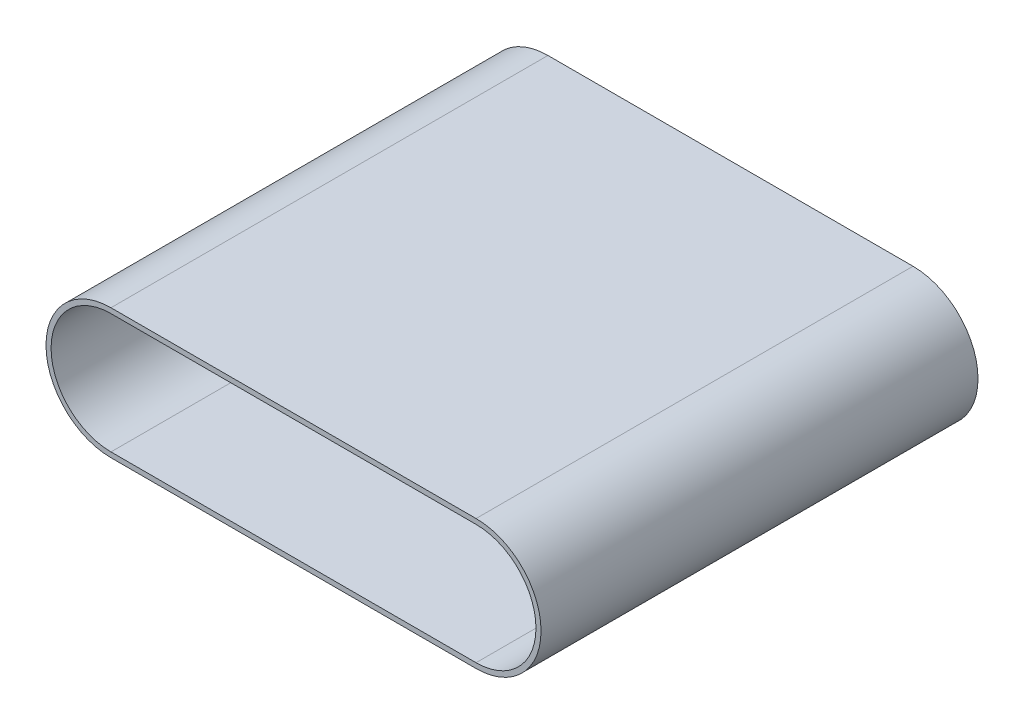
ISO-10303-21;
HEADER;
FILE_DESCRIPTION(('STEP AP214'),'2;1');
FILE_NAME('part.step','',(''),(''),'','','');
FILE_SCHEMA(('AUTOMOTIVE_DESIGN { 1 0 10303 214 1 1 1 1 }'));
ENDSEC;
DATA;
#1=APPLICATION_CONTEXT('core data for automotive mechanical design processes');
#2=APPLICATION_PROTOCOL_DEFINITION('international standard','automotive_design',2000,#1);
#3=PRODUCT_CONTEXT('',#1,'mechanical');
#4=PRODUCT('Part','Part','',(#3));
#5=PRODUCT_RELATED_PRODUCT_CATEGORY('part','',(#4));
#6=PRODUCT_DEFINITION_FORMATION('','',#4);
#7=PRODUCT_DEFINITION_CONTEXT('part definition',#1,'design');
#8=PRODUCT_DEFINITION('design','',#6,#7);
#9=PRODUCT_DEFINITION_SHAPE('','',#8);
#10=(LENGTH_UNIT() NAMED_UNIT(*) SI_UNIT(.MILLI.,.METRE.));
#11=(NAMED_UNIT(*) PLANE_ANGLE_UNIT() SI_UNIT($,.RADIAN.));
#12=(NAMED_UNIT(*) SI_UNIT($,.STERADIAN.) SOLID_ANGLE_UNIT());
#13=UNCERTAINTY_MEASURE_WITH_UNIT(LENGTH_MEASURE(1.E-05),#10,'distance_accuracy_value','');
#14=(GEOMETRIC_REPRESENTATION_CONTEXT(3) GLOBAL_UNCERTAINTY_ASSIGNED_CONTEXT((#13)) GLOBAL_UNIT_ASSIGNED_CONTEXT((#10,
#11,#12)) REPRESENTATION_CONTEXT('',''));
#15=CARTESIAN_POINT('',(0.,0.,0.));
#16=DIRECTION('',(0.,0.,1.));
#17=DIRECTION('',(1.,0.,0.));
#18=AXIS2_PLACEMENT_3D('',#15,#16,#17);
#19=CARTESIAN_POINT('',(0.,0.,65.66));
#20=DIRECTION('',(0.,0.,1.));
#21=DIRECTION('',(1.,0.,0.));
#22=AXIS2_PLACEMENT_3D('',#19,#20,#21);
#23=PLANE('',#22);
#24=CARTESIAN_POINT('',(0.,0.,65.66));
#25=DIRECTION('',(0.,0.,1.));
#26=DIRECTION('',(1.,0.,0.));
#27=AXIS2_PLACEMENT_3D('',#24,#25,#26);
#28=CIRCLE('',#27,9.76200000000001);
#29=CARTESIAN_POINT('',(0.,9.76200000000001,65.66));
#30=VERTEX_POINT('',#29);
#31=CARTESIAN_POINT('',(0.,-9.76200000000001,65.66));
#32=VERTEX_POINT('',#31);
#33=EDGE_CURVE('E183',#30,#32,#28,.T.);
#34=ORIENTED_EDGE('',*,*,#33,.T.);
#35=DIRECTION('',(1.,0.,0.));
#36=VECTOR('',#35,1.);
#37=CARTESIAN_POINT('',(0.,-9.76200000000001,65.66));
#38=LINE('',#37,#36);
#39=CARTESIAN_POINT('',(54.86,-9.762,65.66));
#40=VERTEX_POINT('',#39);
#41=EDGE_CURVE('E187',#32,#40,#38,.T.);
#42=ORIENTED_EDGE('',*,*,#41,.T.);
#43=CARTESIAN_POINT('',(54.86,0.,65.66));
#44=DIRECTION('',(0.,0.,1.));
#45=DIRECTION('',(1.,0.,0.));
#46=AXIS2_PLACEMENT_3D('',#43,#44,#45);
#47=CIRCLE('',#46,9.762);
#48=CARTESIAN_POINT('',(54.86,9.762,65.66));
#49=VERTEX_POINT('',#48);
#50=EDGE_CURVE('E191',#40,#49,#47,.T.);
#51=ORIENTED_EDGE('',*,*,#50,.T.);
#52=DIRECTION('',(-1.,0.,0.));
#53=VECTOR('',#52,1.);
#54=CARTESIAN_POINT('',(0.,9.76200000000001,65.66));
#55=LINE('',#54,#53);
#56=EDGE_CURVE('E194',#49,#30,#55,.T.);
#57=ORIENTED_EDGE('',*,*,#56,.T.);
#58=EDGE_LOOP('',(#34,#42,#51,#57));
#59=FACE_BOUND('',#58,.T.);
#60=DIRECTION('',(1.,0.,0.));
#61=VECTOR('',#60,1.);
#62=CARTESIAN_POINT('',(0.,-9.00000000000001,65.66));
#63=LINE('',#62,#61);
#64=CARTESIAN_POINT('',(0.,-9.00000000000001,65.66));
#65=VERTEX_POINT('',#64);
#66=CARTESIAN_POINT('',(54.86,-9.,65.66));
#67=VERTEX_POINT('',#66);
#68=EDGE_CURVE('E144',#65,#67,#63,.T.);
#69=ORIENTED_EDGE('',*,*,#68,.F.);
#70=CARTESIAN_POINT('',(0.,0.,65.66));
#71=DIRECTION('',(0.,0.,1.));
#72=DIRECTION('',(1.,0.,0.));
#73=AXIS2_PLACEMENT_3D('',#70,#71,#72);
#74=CIRCLE('',#73,9.00000000000001);
#75=CARTESIAN_POINT('',(0.,9.00000000000001,65.66));
#76=VERTEX_POINT('',#75);
#77=EDGE_CURVE('E135',#76,#65,#74,.T.);
#78=ORIENTED_EDGE('',*,*,#77,.F.);
#79=DIRECTION('',(-1.,0.,0.));
#80=VECTOR('',#79,1.);
#81=CARTESIAN_POINT('',(0.,9.00000000000001,65.66));
#82=LINE('',#81,#80);
#83=CARTESIAN_POINT('',(54.86,9.,65.66));
#84=VERTEX_POINT('',#83);
#85=EDGE_CURVE('E161',#84,#76,#82,.T.);
#86=ORIENTED_EDGE('',*,*,#85,.F.);
#87=CARTESIAN_POINT('',(54.86,0.,65.66));
#88=DIRECTION('',(0.,0.,1.));
#89=DIRECTION('',(1.,0.,0.));
#90=AXIS2_PLACEMENT_3D('',#87,#88,#89);
#91=CIRCLE('',#90,9.);
#92=EDGE_CURVE('E157',#67,#84,#91,.T.);
#93=ORIENTED_EDGE('',*,*,#92,.F.);
#94=EDGE_LOOP('',(#69,#78,#86,#93));
#95=FACE_BOUND('',#94,.T.);
#96=ADVANCED_FACE('F69',(#59,#95),#23,.T.);
#97=CARTESIAN_POINT('',(0.,0.,0.));
#98=DIRECTION('',(0.,0.,1.));
#99=DIRECTION('',(1.,0.,0.));
#100=AXIS2_PLACEMENT_3D('',#97,#98,#99);
#101=PLANE('',#100);
#102=CARTESIAN_POINT('',(0.,0.,0.));
#103=DIRECTION('',(0.,0.,1.));
#104=DIRECTION('',(1.,0.,0.));
#105=AXIS2_PLACEMENT_3D('',#102,#103,#104);
#106=CIRCLE('',#105,9.76200000000001);
#107=CARTESIAN_POINT('',(0.,9.76200000000001,0.));
#108=VERTEX_POINT('',#107);
#109=CARTESIAN_POINT('',(0.,-9.76200000000001,0.));
#110=VERTEX_POINT('',#109);
#111=EDGE_CURVE('E153',#108,#110,#106,.T.);
#112=ORIENTED_EDGE('',*,*,#111,.F.);
#113=DIRECTION('',(-1.,0.,0.));
#114=VECTOR('',#113,1.);
#115=CARTESIAN_POINT('',(0.,9.76200000000001,0.));
#116=LINE('',#115,#114);
#117=CARTESIAN_POINT('',(54.86,9.762,0.));
#118=VERTEX_POINT('',#117);
#119=EDGE_CURVE('E188',#118,#108,#116,.T.);
#120=ORIENTED_EDGE('',*,*,#119,.F.);
#121=CARTESIAN_POINT('',(54.86,0.,0.));
#122=DIRECTION('',(0.,0.,1.));
#123=DIRECTION('',(1.,0.,0.));
#124=AXIS2_PLACEMENT_3D('',#121,#122,#123);
#125=CIRCLE('',#124,9.762);
#126=CARTESIAN_POINT('',(54.86,-9.762,0.));
#127=VERTEX_POINT('',#126);
#128=EDGE_CURVE('E204',#127,#118,#125,.T.);
#129=ORIENTED_EDGE('',*,*,#128,.F.);
#130=DIRECTION('',(1.,0.,0.));
#131=VECTOR('',#130,1.);
#132=CARTESIAN_POINT('',(0.,-9.76200000000001,0.));
#133=LINE('',#132,#131);
#134=EDGE_CURVE('E201',#110,#127,#133,.T.);
#135=ORIENTED_EDGE('',*,*,#134,.F.);
#136=EDGE_LOOP('',(#112,#120,#129,#135));
#137=FACE_BOUND('',#136,.T.);
#138=CARTESIAN_POINT('',(0.,0.,0.));
#139=DIRECTION('',(0.,0.,1.));
#140=DIRECTION('',(1.,0.,0.));
#141=AXIS2_PLACEMENT_3D('',#138,#139,#140);
#142=CIRCLE('',#141,9.00000000000001);
#143=CARTESIAN_POINT('',(0.,9.00000000000001,0.));
#144=VERTEX_POINT('',#143);
#145=CARTESIAN_POINT('',(0.,-9.00000000000001,0.));
#146=VERTEX_POINT('',#145);
#147=EDGE_CURVE('E93',#144,#146,#142,.T.);
#148=ORIENTED_EDGE('',*,*,#147,.T.);
#149=DIRECTION('',(1.,0.,0.));
#150=VECTOR('',#149,1.);
#151=CARTESIAN_POINT('',(0.,-9.00000000000001,0.));
#152=LINE('',#151,#150);
#153=CARTESIAN_POINT('',(54.86,-9.,0.));
#154=VERTEX_POINT('',#153);
#155=EDGE_CURVE('E151',#146,#154,#152,.T.);
#156=ORIENTED_EDGE('',*,*,#155,.T.);
#157=CARTESIAN_POINT('',(54.86,0.,0.));
#158=DIRECTION('',(0.,0.,1.));
#159=DIRECTION('',(1.,0.,0.));
#160=AXIS2_PLACEMENT_3D('',#157,#158,#159);
#161=CIRCLE('',#160,9.);
#162=CARTESIAN_POINT('',(54.86,9.,0.));
#163=VERTEX_POINT('',#162);
#164=EDGE_CURVE('E170',#154,#163,#161,.T.);
#165=ORIENTED_EDGE('',*,*,#164,.T.);
#166=DIRECTION('',(-1.,0.,0.));
#167=VECTOR('',#166,1.);
#168=CARTESIAN_POINT('',(0.,9.00000000000001,0.));
#169=LINE('',#168,#167);
#170=EDGE_CURVE('E145',#163,#144,#169,.T.);
#171=ORIENTED_EDGE('',*,*,#170,.T.);
#172=EDGE_LOOP('',(#148,#156,#165,#171));
#173=FACE_BOUND('',#172,.T.);
#174=ADVANCED_FACE('F227',(#137,#173),#101,.F.);
#175=CARTESIAN_POINT('',(0.,0.,65.66));
#176=DIRECTION('',(0.,0.,-1.));
#177=DIRECTION('',(-1.,0.,0.));
#178=AXIS2_PLACEMENT_3D('',#175,#176,#177);
#179=CYLINDRICAL_SURFACE('',#178,9.76200000000001);
#180=ORIENTED_EDGE('',*,*,#111,.T.);
#181=DIRECTION('',(0.,0.,-1.));
#182=VECTOR('',#181,1.);
#183=CARTESIAN_POINT('',(0.,-9.76200000000001,65.66));
#184=LINE('',#183,#182);
#185=EDGE_CURVE('E12',#32,#110,#184,.T.);
#186=ORIENTED_EDGE('',*,*,#185,.F.);
#187=ORIENTED_EDGE('',*,*,#33,.F.);
#188=DIRECTION('',(0.,0.,-1.));
#189=VECTOR('',#188,1.);
#190=CARTESIAN_POINT('',(0.,9.76200000000001,65.66));
#191=LINE('',#190,#189);
#192=EDGE_CURVE('E197',#30,#108,#191,.T.);
#193=ORIENTED_EDGE('',*,*,#192,.T.);
#194=EDGE_LOOP('',(#180,#186,#187,#193));
#195=FACE_BOUND('',#194,.T.);
#196=ADVANCED_FACE('F71',(#195),#179,.T.);
#197=CARTESIAN_POINT('',(0.,-9.76200000000001,65.66));
#198=DIRECTION('',(0.,1.,0.));
#199=DIRECTION('',(-1.,0.,0.));
#200=AXIS2_PLACEMENT_3D('',#197,#198,#199);
#201=PLANE('',#200);
#202=ORIENTED_EDGE('',*,*,#134,.T.);
#203=DIRECTION('',(0.,0.,-1.));
#204=VECTOR('',#203,1.);
#205=CARTESIAN_POINT('',(54.86,-9.762,65.66));
#206=LINE('',#205,#204);
#207=EDGE_CURVE('E78',#40,#127,#206,.T.);
#208=ORIENTED_EDGE('',*,*,#207,.F.);
#209=ORIENTED_EDGE('',*,*,#41,.F.);
#210=ORIENTED_EDGE('',*,*,#185,.T.);
#211=EDGE_LOOP('',(#202,#208,#209,#210));
#212=FACE_BOUND('',#211,.T.);
#213=ADVANCED_FACE('F237',(#212),#201,.F.);
#214=CARTESIAN_POINT('',(54.86,0.,65.66));
#215=DIRECTION('',(0.,0.,-1.));
#216=DIRECTION('',(-1.,0.,0.));
#217=AXIS2_PLACEMENT_3D('',#214,#215,#216);
#218=CYLINDRICAL_SURFACE('',#217,9.762);
#219=ORIENTED_EDGE('',*,*,#128,.T.);
#220=DIRECTION('',(0.,0.,-1.));
#221=VECTOR('',#220,1.);
#222=CARTESIAN_POINT('',(54.86,9.762,65.66));
#223=LINE('',#222,#221);
#224=EDGE_CURVE('E212',#49,#118,#223,.T.);
#225=ORIENTED_EDGE('',*,*,#224,.F.);
#226=ORIENTED_EDGE('',*,*,#50,.F.);
#227=ORIENTED_EDGE('',*,*,#207,.T.);
#228=EDGE_LOOP('',(#219,#225,#226,#227));
#229=FACE_BOUND('',#228,.T.);
#230=ADVANCED_FACE('F221',(#229),#218,.T.);
#231=CARTESIAN_POINT('',(0.,9.76200000000001,65.66));
#232=DIRECTION('',(0.,-1.,0.));
#233=DIRECTION('',(1.,0.,0.));
#234=AXIS2_PLACEMENT_3D('',#231,#232,#233);
#235=PLANE('',#234);
#236=ORIENTED_EDGE('',*,*,#119,.T.);
#237=ORIENTED_EDGE('',*,*,#192,.F.);
#238=ORIENTED_EDGE('',*,*,#56,.F.);
#239=ORIENTED_EDGE('',*,*,#224,.T.);
#240=EDGE_LOOP('',(#236,#237,#238,#239));
#241=FACE_BOUND('',#240,.T.);
#242=ADVANCED_FACE('F231',(#241),#235,.F.);
#243=CARTESIAN_POINT('',(0.,0.,65.66));
#244=DIRECTION('',(0.,0.,-1.));
#245=DIRECTION('',(-1.,0.,0.));
#246=AXIS2_PLACEMENT_3D('',#243,#244,#245);
#247=CYLINDRICAL_SURFACE('',#246,9.00000000000001);
#248=ORIENTED_EDGE('',*,*,#147,.F.);
#249=DIRECTION('',(0.,0.,-1.));
#250=VECTOR('',#249,1.);
#251=CARTESIAN_POINT('',(0.,9.00000000000001,65.66));
#252=LINE('',#251,#250);
#253=EDGE_CURVE('E139',#76,#144,#252,.T.);
#254=ORIENTED_EDGE('',*,*,#253,.F.);
#255=ORIENTED_EDGE('',*,*,#77,.T.);
#256=DIRECTION('',(0.,0.,-1.));
#257=VECTOR('',#256,1.);
#258=CARTESIAN_POINT('',(0.,-9.00000000000001,65.66));
#259=LINE('',#258,#257);
#260=EDGE_CURVE('E138',#65,#146,#259,.T.);
#261=ORIENTED_EDGE('',*,*,#260,.T.);
#262=EDGE_LOOP('',(#248,#254,#255,#261));
#263=FACE_BOUND('',#262,.T.);
#264=ADVANCED_FACE('F137',(#263),#247,.F.);
#265=CARTESIAN_POINT('',(0.,-9.00000000000001,65.66));
#266=DIRECTION('',(0.,1.,0.));
#267=DIRECTION('',(-1.,0.,0.));
#268=AXIS2_PLACEMENT_3D('',#265,#266,#267);
#269=PLANE('',#268);
#270=ORIENTED_EDGE('',*,*,#155,.F.);
#271=ORIENTED_EDGE('',*,*,#260,.F.);
#272=ORIENTED_EDGE('',*,*,#68,.T.);
#273=DIRECTION('',(0.,0.,-1.));
#274=VECTOR('',#273,1.);
#275=CARTESIAN_POINT('',(54.86,-9.,65.66));
#276=LINE('',#275,#274);
#277=EDGE_CURVE('E154',#67,#154,#276,.T.);
#278=ORIENTED_EDGE('',*,*,#277,.T.);
#279=EDGE_LOOP('',(#270,#271,#272,#278));
#280=FACE_BOUND('',#279,.T.);
#281=ADVANCED_FACE('F148',(#280),#269,.T.);
#282=CARTESIAN_POINT('',(54.86,0.,65.66));
#283=DIRECTION('',(0.,0.,-1.));
#284=DIRECTION('',(-1.,0.,0.));
#285=AXIS2_PLACEMENT_3D('',#282,#283,#284);
#286=CYLINDRICAL_SURFACE('',#285,9.);
#287=ORIENTED_EDGE('',*,*,#164,.F.);
#288=ORIENTED_EDGE('',*,*,#277,.F.);
#289=ORIENTED_EDGE('',*,*,#92,.T.);
#290=DIRECTION('',(0.,0.,-1.));
#291=VECTOR('',#290,1.);
#292=CARTESIAN_POINT('',(54.86,9.,65.66));
#293=LINE('',#292,#291);
#294=EDGE_CURVE('E85',#84,#163,#293,.T.);
#295=ORIENTED_EDGE('',*,*,#294,.T.);
#296=EDGE_LOOP('',(#287,#288,#289,#295));
#297=FACE_BOUND('',#296,.T.);
#298=ADVANCED_FACE('F260',(#297),#286,.F.);
#299=CARTESIAN_POINT('',(0.,9.00000000000001,65.66));
#300=DIRECTION('',(0.,-1.,0.));
#301=DIRECTION('',(1.,0.,0.));
#302=AXIS2_PLACEMENT_3D('',#299,#300,#301);
#303=PLANE('',#302);
#304=ORIENTED_EDGE('',*,*,#170,.F.);
#305=ORIENTED_EDGE('',*,*,#294,.F.);
#306=ORIENTED_EDGE('',*,*,#85,.T.);
#307=ORIENTED_EDGE('',*,*,#253,.T.);
#308=EDGE_LOOP('',(#304,#305,#306,#307));
#309=FACE_BOUND('',#308,.T.);
#310=ADVANCED_FACE('F264',(#309),#303,.T.);
#311=CLOSED_SHELL('',(#96,#174,#196,#213,#230,#242,#264,#281,#298,#310));
#312=MANIFOLD_SOLID_BREP('B2',#311);
#313=ADVANCED_BREP_SHAPE_REPRESENTATION('',(#18,#312),#14);
#314=SHAPE_DEFINITION_REPRESENTATION(#9,#313);
ENDSEC;
END-ISO-10303-21;
